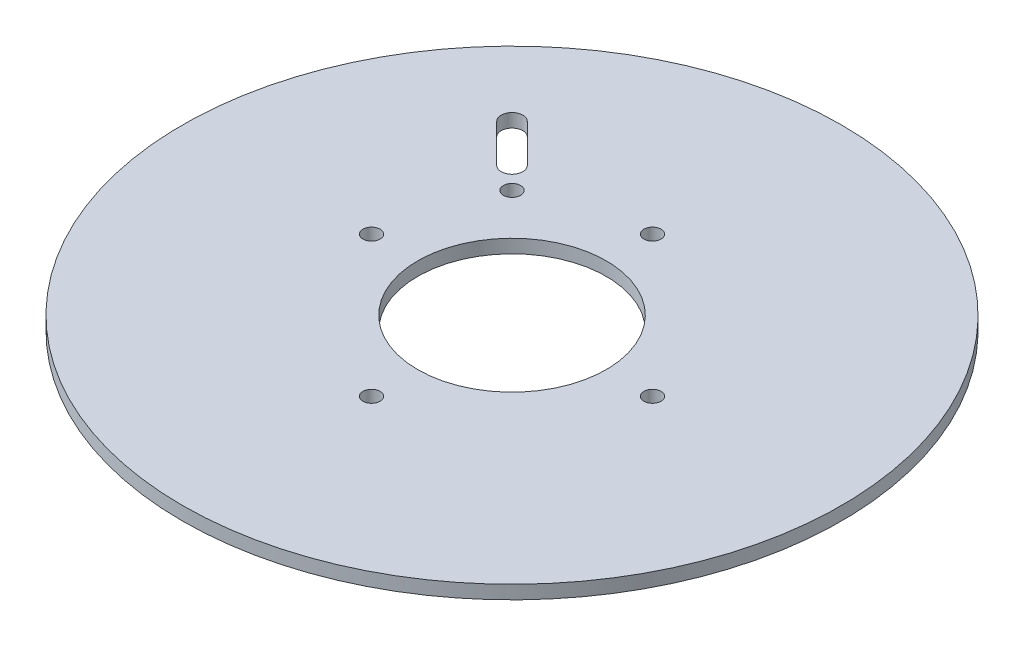
ISO-10303-21;
HEADER;
FILE_DESCRIPTION(('STEP AP214'),'2;1');
FILE_NAME('part.step','',(''),(''),'','','');
FILE_SCHEMA(('AUTOMOTIVE_DESIGN { 1 0 10303 214 1 1 1 1 }'));
ENDSEC;
DATA;
#1=APPLICATION_CONTEXT('core data for automotive mechanical design processes');
#2=APPLICATION_PROTOCOL_DEFINITION('international standard','automotive_design',2000,#1);
#3=PRODUCT_CONTEXT('',#1,'mechanical');
#4=PRODUCT('Part','Part','',(#3));
#5=PRODUCT_RELATED_PRODUCT_CATEGORY('part','',(#4));
#6=PRODUCT_DEFINITION_FORMATION('','',#4);
#7=PRODUCT_DEFINITION_CONTEXT('part definition',#1,'design');
#8=PRODUCT_DEFINITION('design','',#6,#7);
#9=PRODUCT_DEFINITION_SHAPE('','',#8);
#10=(LENGTH_UNIT() NAMED_UNIT(*) SI_UNIT(.MILLI.,.METRE.));
#11=(NAMED_UNIT(*) PLANE_ANGLE_UNIT() SI_UNIT($,.RADIAN.));
#12=(NAMED_UNIT(*) SI_UNIT($,.STERADIAN.) SOLID_ANGLE_UNIT());
#13=UNCERTAINTY_MEASURE_WITH_UNIT(LENGTH_MEASURE(1.E-05),#10,'distance_accuracy_value','');
#14=(GEOMETRIC_REPRESENTATION_CONTEXT(3) GLOBAL_UNCERTAINTY_ASSIGNED_CONTEXT((#13)) GLOBAL_UNIT_ASSIGNED_CONTEXT((#10,
#11,#12)) REPRESENTATION_CONTEXT('',''));
#15=CARTESIAN_POINT('',(0.,0.,0.));
#16=DIRECTION('',(0.,0.,1.));
#17=DIRECTION('',(1.,0.,0.));
#18=AXIS2_PLACEMENT_3D('',#15,#16,#17);
#19=CARTESIAN_POINT('',(0.,3.175,0.));
#20=DIRECTION('',(0.,-1.,0.));
#21=DIRECTION('',(0.,0.,-1.));
#22=AXIS2_PLACEMENT_3D('',#19,#20,#21);
#23=CYLINDRICAL_SURFACE('',#22,77.4600051);
#24=CARTESIAN_POINT('',(0.,3.175,0.));
#25=DIRECTION('',(0.,1.,0.));
#26=DIRECTION('',(0.,0.,1.));
#27=AXIS2_PLACEMENT_3D('',#24,#25,#26);
#28=CIRCLE('',#27,77.4600051);
#29=CARTESIAN_POINT('',(0.,3.175,77.4600051));
#30=VERTEX_POINT('',#29);
#31=EDGE_CURVE('E11',#30,#30,#28,.T.);
#32=ORIENTED_EDGE('',*,*,#31,.F.);
#33=EDGE_LOOP('',(#32));
#34=FACE_BOUND('',#33,.T.);
#35=CARTESIAN_POINT('',(0.,0.,0.));
#36=DIRECTION('',(0.,1.,0.));
#37=DIRECTION('',(0.,0.,1.));
#38=AXIS2_PLACEMENT_3D('',#35,#36,#37);
#39=CIRCLE('',#38,77.4600051);
#40=CARTESIAN_POINT('',(0.,0.,77.4600051));
#41=VERTEX_POINT('',#40);
#42=EDGE_CURVE('E37',#41,#41,#39,.T.);
#43=ORIENTED_EDGE('',*,*,#42,.T.);
#44=EDGE_LOOP('',(#43));
#45=FACE_BOUND('',#44,.T.);
#46=ADVANCED_FACE('F34',(#34,#45),#23,.T.);
#47=CARTESIAN_POINT('',(0.,3.175,0.));
#48=DIRECTION('',(0.,1.,0.));
#49=DIRECTION('',(0.,0.,1.));
#50=AXIS2_PLACEMENT_3D('',#47,#48,#49);
#51=PLANE('',#50);
#52=CARTESIAN_POINT('',(-30.48,3.175,-30.48));
#53=DIRECTION('',(0.,1.,0.));
#54=DIRECTION('',(0.,0.,1.));
#55=AXIS2_PLACEMENT_3D('',#52,#53,#54);
#56=CIRCLE('',#55,2.54000000000001);
#57=CARTESIAN_POINT('',(-32.2760512242138,3.175,-28.6839487757862));
#58=VERTEX_POINT('',#57);
#59=CARTESIAN_POINT('',(-28.6839487757862,3.175,-32.2760512242138));
#60=VERTEX_POINT('',#59);
#61=EDGE_CURVE('E48',#58,#60,#56,.T.);
#62=ORIENTED_EDGE('',*,*,#61,.F.);
#63=DIRECTION('',(0.707106781186551,0.,0.707106781186544));
#64=VECTOR('',#63,1.);
#65=CARTESIAN_POINT('',(-32.2760512242138,3.175,-28.6839487757862));
#66=LINE('',#65,#64);
#67=CARTESIAN_POINT('',(-41.256307345283,3.175,-37.6642048968553));
#68=VERTEX_POINT('',#67);
#69=EDGE_CURVE('E92',#68,#58,#66,.T.);
#70=ORIENTED_EDGE('',*,*,#69,.F.);
#71=CARTESIAN_POINT('',(-39.4602561210692,3.175,-39.4602561210691));
#72=DIRECTION('',(0.,1.,0.));
#73=DIRECTION('',(0.,0.,1.));
#74=AXIS2_PLACEMENT_3D('',#71,#72,#73);
#75=CIRCLE('',#74,2.54);
#76=CARTESIAN_POINT('',(-37.6642048968554,3.175,-41.2563073452829));
#77=VERTEX_POINT('',#76);
#78=EDGE_CURVE('E95',#77,#68,#75,.T.);
#79=ORIENTED_EDGE('',*,*,#78,.F.);
#80=DIRECTION('',(-0.707106781186552,0.,-0.707106781186543));
#81=VECTOR('',#80,1.);
#82=CARTESIAN_POINT('',(-28.6839487757862,3.175,-32.2760512242139));
#83=LINE('',#82,#81);
#84=EDGE_CURVE('E104',#60,#77,#83,.T.);
#85=ORIENTED_EDGE('',*,*,#84,.F.);
#86=EDGE_LOOP('',(#62,#70,#79,#85));
#87=FACE_BOUND('',#86,.T.);
#88=CARTESIAN_POINT('',(-33.02,3.175,0.));
#89=DIRECTION('',(0.,1.,0.));
#90=DIRECTION('',(0.,0.,1.));
#91=AXIS2_PLACEMENT_3D('',#88,#89,#90);
#92=CIRCLE('',#91,2.0193);
#93=CARTESIAN_POINT('',(-33.02,3.175,2.0193));
#94=VERTEX_POINT('',#93);
#95=EDGE_CURVE('E98',#94,#94,#92,.T.);
#96=ORIENTED_EDGE('',*,*,#95,.F.);
#97=EDGE_LOOP('',(#96));
#98=FACE_BOUND('',#97,.T.);
#99=CARTESIAN_POINT('',(0.,3.175,33.02));
#100=DIRECTION('',(0.,1.,0.));
#101=DIRECTION('',(0.,0.,1.));
#102=AXIS2_PLACEMENT_3D('',#99,#100,#101);
#103=CIRCLE('',#102,2.0193);
#104=CARTESIAN_POINT('',(0.,3.175,35.0393));
#105=VERTEX_POINT('',#104);
#106=EDGE_CURVE('E197',#105,#105,#103,.T.);
#107=ORIENTED_EDGE('',*,*,#106,.F.);
#108=EDGE_LOOP('',(#107));
#109=FACE_BOUND('',#108,.T.);
#110=CARTESIAN_POINT('',(33.02,3.175,0.));
#111=DIRECTION('',(0.,1.,0.));
#112=DIRECTION('',(0.,0.,1.));
#113=AXIS2_PLACEMENT_3D('',#110,#111,#112);
#114=CIRCLE('',#113,2.0193);
#115=CARTESIAN_POINT('',(33.02,3.175,2.0193));
#116=VERTEX_POINT('',#115);
#117=EDGE_CURVE('E129',#116,#116,#114,.T.);
#118=ORIENTED_EDGE('',*,*,#117,.F.);
#119=EDGE_LOOP('',(#118));
#120=FACE_BOUND('',#119,.T.);
#121=CARTESIAN_POINT('',(0.,3.175,-33.02));
#122=DIRECTION('',(0.,1.,0.));
#123=DIRECTION('',(0.,0.,1.));
#124=AXIS2_PLACEMENT_3D('',#121,#122,#123);
#125=CIRCLE('',#124,2.0193);
#126=CARTESIAN_POINT('',(0.,3.175,-31.0007));
#127=VERTEX_POINT('',#126);
#128=EDGE_CURVE('E123',#127,#127,#125,.T.);
#129=ORIENTED_EDGE('',*,*,#128,.F.);
#130=EDGE_LOOP('',(#129));
#131=FACE_BOUND('',#130,.T.);
#132=CARTESIAN_POINT('',(-25.4,3.175,-25.4));
#133=DIRECTION('',(0.,1.,0.));
#134=DIRECTION('',(0.,0.,1.));
#135=AXIS2_PLACEMENT_3D('',#132,#133,#134);
#136=CIRCLE('',#135,2.0193);
#137=CARTESIAN_POINT('',(-25.4,3.175,-23.3807));
#138=VERTEX_POINT('',#137);
#139=EDGE_CURVE('E117',#138,#138,#136,.T.);
#140=ORIENTED_EDGE('',*,*,#139,.F.);
#141=EDGE_LOOP('',(#140));
#142=FACE_BOUND('',#141,.T.);
#143=CARTESIAN_POINT('',(0.,3.175,0.));
#144=DIRECTION('',(0.,1.,0.));
#145=DIRECTION('',(0.,0.,1.));
#146=AXIS2_PLACEMENT_3D('',#143,#144,#145);
#147=CIRCLE('',#146,22.1615);
#148=CARTESIAN_POINT('',(0.,3.175,22.1615));
#149=VERTEX_POINT('',#148);
#150=EDGE_CURVE('E116',#149,#149,#147,.T.);
#151=ORIENTED_EDGE('',*,*,#150,.F.);
#152=EDGE_LOOP('',(#151));
#153=FACE_BOUND('',#152,.T.);
#154=ORIENTED_EDGE('',*,*,#31,.T.);
#155=EDGE_LOOP('',(#154));
#156=FACE_BOUND('',#155,.T.);
#157=ADVANCED_FACE('F141',(#87,#98,#109,#120,#131,#142,#153,#156),#51,.T.);
#158=CARTESIAN_POINT('',(0.,0.,0.));
#159=DIRECTION('',(0.,1.,0.));
#160=DIRECTION('',(0.,0.,1.));
#161=AXIS2_PLACEMENT_3D('',#158,#159,#160);
#162=PLANE('',#161);
#163=DIRECTION('',(0.707106781186551,0.,0.707106781186544));
#164=VECTOR('',#163,1.);
#165=CARTESIAN_POINT('',(-32.2760512242138,0.,-28.6839487757862));
#166=LINE('',#165,#164);
#167=CARTESIAN_POINT('',(-41.256307345283,0.,-37.6642048968553));
#168=VERTEX_POINT('',#167);
#169=CARTESIAN_POINT('',(-32.2760512242138,0.,-28.6839487757862));
#170=VERTEX_POINT('',#169);
#171=EDGE_CURVE('E82',#168,#170,#166,.T.);
#172=ORIENTED_EDGE('',*,*,#171,.T.);
#173=CARTESIAN_POINT('',(-30.48,0.,-30.48));
#174=DIRECTION('',(0.,1.,0.));
#175=DIRECTION('',(0.,0.,1.));
#176=AXIS2_PLACEMENT_3D('',#173,#174,#175);
#177=CIRCLE('',#176,2.54000000000001);
#178=CARTESIAN_POINT('',(-28.6839487757862,0.,-32.2760512242139));
#179=VERTEX_POINT('',#178);
#180=EDGE_CURVE('E76',#170,#179,#177,.T.);
#181=ORIENTED_EDGE('',*,*,#180,.T.);
#182=DIRECTION('',(-0.707106781186552,0.,-0.707106781186543));
#183=VECTOR('',#182,1.);
#184=CARTESIAN_POINT('',(-28.6839487757862,0.,-32.2760512242139));
#185=LINE('',#184,#183);
#186=CARTESIAN_POINT('',(-37.6642048968554,0.,-41.2563073452829));
#187=VERTEX_POINT('',#186);
#188=EDGE_CURVE('E85',#179,#187,#185,.T.);
#189=ORIENTED_EDGE('',*,*,#188,.T.);
#190=CARTESIAN_POINT('',(-39.4602561210692,0.,-39.4602561210691));
#191=DIRECTION('',(0.,1.,0.));
#192=DIRECTION('',(0.,0.,1.));
#193=AXIS2_PLACEMENT_3D('',#190,#191,#192);
#194=CIRCLE('',#193,2.54);
#195=EDGE_CURVE('E56',#187,#168,#194,.T.);
#196=ORIENTED_EDGE('',*,*,#195,.T.);
#197=EDGE_LOOP('',(#172,#181,#189,#196));
#198=FACE_BOUND('',#197,.T.);
#199=CARTESIAN_POINT('',(-33.02,0.,0.));
#200=DIRECTION('',(0.,1.,0.));
#201=DIRECTION('',(0.,0.,1.));
#202=AXIS2_PLACEMENT_3D('',#199,#200,#201);
#203=CIRCLE('',#202,2.0193);
#204=CARTESIAN_POINT('',(-33.02,0.,2.0193));
#205=VERTEX_POINT('',#204);
#206=EDGE_CURVE('E199',#205,#205,#203,.T.);
#207=ORIENTED_EDGE('',*,*,#206,.T.);
#208=EDGE_LOOP('',(#207));
#209=FACE_BOUND('',#208,.T.);
#210=CARTESIAN_POINT('',(0.,0.,33.02));
#211=DIRECTION('',(0.,1.,0.));
#212=DIRECTION('',(0.,0.,1.));
#213=AXIS2_PLACEMENT_3D('',#210,#211,#212);
#214=CIRCLE('',#213,2.0193);
#215=CARTESIAN_POINT('',(0.,0.,35.0393));
#216=VERTEX_POINT('',#215);
#217=EDGE_CURVE('E132',#216,#216,#214,.T.);
#218=ORIENTED_EDGE('',*,*,#217,.T.);
#219=EDGE_LOOP('',(#218));
#220=FACE_BOUND('',#219,.T.);
#221=CARTESIAN_POINT('',(33.02,0.,0.));
#222=DIRECTION('',(0.,1.,0.));
#223=DIRECTION('',(0.,0.,1.));
#224=AXIS2_PLACEMENT_3D('',#221,#222,#223);
#225=CIRCLE('',#224,2.0193);
#226=CARTESIAN_POINT('',(33.02,0.,2.0193));
#227=VERTEX_POINT('',#226);
#228=EDGE_CURVE('E126',#227,#227,#225,.T.);
#229=ORIENTED_EDGE('',*,*,#228,.T.);
#230=EDGE_LOOP('',(#229));
#231=FACE_BOUND('',#230,.T.);
#232=CARTESIAN_POINT('',(0.,0.,-33.02));
#233=DIRECTION('',(0.,1.,0.));
#234=DIRECTION('',(0.,0.,1.));
#235=AXIS2_PLACEMENT_3D('',#232,#233,#234);
#236=CIRCLE('',#235,2.0193);
#237=CARTESIAN_POINT('',(0.,0.,-31.0007));
#238=VERTEX_POINT('',#237);
#239=EDGE_CURVE('E120',#238,#238,#236,.T.);
#240=ORIENTED_EDGE('',*,*,#239,.T.);
#241=EDGE_LOOP('',(#240));
#242=FACE_BOUND('',#241,.T.);
#243=CARTESIAN_POINT('',(-25.4,0.,-25.4));
#244=DIRECTION('',(0.,1.,0.));
#245=DIRECTION('',(0.,0.,1.));
#246=AXIS2_PLACEMENT_3D('',#243,#244,#245);
#247=CIRCLE('',#246,2.0193);
#248=CARTESIAN_POINT('',(-25.4,0.,-23.3807));
#249=VERTEX_POINT('',#248);
#250=EDGE_CURVE('E113',#249,#249,#247,.T.);
#251=ORIENTED_EDGE('',*,*,#250,.T.);
#252=EDGE_LOOP('',(#251));
#253=FACE_BOUND('',#252,.T.);
#254=CARTESIAN_POINT('',(0.,0.,0.));
#255=DIRECTION('',(0.,1.,0.));
#256=DIRECTION('',(0.,0.,1.));
#257=AXIS2_PLACEMENT_3D('',#254,#255,#256);
#258=CIRCLE('',#257,22.1615);
#259=CARTESIAN_POINT('',(0.,0.,22.1615));
#260=VERTEX_POINT('',#259);
#261=EDGE_CURVE('E133',#260,#260,#258,.T.);
#262=ORIENTED_EDGE('',*,*,#261,.T.);
#263=EDGE_LOOP('',(#262));
#264=FACE_BOUND('',#263,.T.);
#265=ORIENTED_EDGE('',*,*,#42,.F.);
#266=EDGE_LOOP('',(#265));
#267=FACE_BOUND('',#266,.T.);
#268=ADVANCED_FACE('F89',(#198,#209,#220,#231,#242,#253,#264,#267),#162,.F.);
#269=CARTESIAN_POINT('',(0.,0.,0.));
#270=DIRECTION('',(0.,1.,0.));
#271=DIRECTION('',(0.,0.,1.));
#272=AXIS2_PLACEMENT_3D('',#269,#270,#271);
#273=CYLINDRICAL_SURFACE('',#272,22.1615);
#274=ORIENTED_EDGE('',*,*,#261,.F.);
#275=EDGE_LOOP('',(#274));
#276=FACE_BOUND('',#275,.T.);
#277=ORIENTED_EDGE('',*,*,#150,.T.);
#278=EDGE_LOOP('',(#277));
#279=FACE_BOUND('',#278,.T.);
#280=ADVANCED_FACE('F139',(#276,#279),#273,.F.);
#281=CARTESIAN_POINT('',(-25.4,0.,-25.4));
#282=DIRECTION('',(0.,1.,0.));
#283=DIRECTION('',(0.,0.,1.));
#284=AXIS2_PLACEMENT_3D('',#281,#282,#283);
#285=CYLINDRICAL_SURFACE('',#284,2.0193);
#286=ORIENTED_EDGE('',*,*,#250,.F.);
#287=EDGE_LOOP('',(#286));
#288=FACE_BOUND('',#287,.T.);
#289=ORIENTED_EDGE('',*,*,#139,.T.);
#290=EDGE_LOOP('',(#289));
#291=FACE_BOUND('',#290,.T.);
#292=ADVANCED_FACE('F157',(#288,#291),#285,.F.);
#293=CARTESIAN_POINT('',(0.,0.,-33.02));
#294=DIRECTION('',(0.,1.,0.));
#295=DIRECTION('',(0.,0.,1.));
#296=AXIS2_PLACEMENT_3D('',#293,#294,#295);
#297=CYLINDRICAL_SURFACE('',#296,2.0193);
#298=ORIENTED_EDGE('',*,*,#239,.F.);
#299=EDGE_LOOP('',(#298));
#300=FACE_BOUND('',#299,.T.);
#301=ORIENTED_EDGE('',*,*,#128,.T.);
#302=EDGE_LOOP('',(#301));
#303=FACE_BOUND('',#302,.T.);
#304=ADVANCED_FACE('F165',(#300,#303),#297,.F.);
#305=CARTESIAN_POINT('',(33.02,0.,0.));
#306=DIRECTION('',(0.,1.,0.));
#307=DIRECTION('',(0.,0.,1.));
#308=AXIS2_PLACEMENT_3D('',#305,#306,#307);
#309=CYLINDRICAL_SURFACE('',#308,2.0193);
#310=ORIENTED_EDGE('',*,*,#228,.F.);
#311=EDGE_LOOP('',(#310));
#312=FACE_BOUND('',#311,.T.);
#313=ORIENTED_EDGE('',*,*,#117,.T.);
#314=EDGE_LOOP('',(#313));
#315=FACE_BOUND('',#314,.T.);
#316=ADVANCED_FACE('F161',(#312,#315),#309,.F.);
#317=CARTESIAN_POINT('',(0.,0.,33.02));
#318=DIRECTION('',(0.,1.,0.));
#319=DIRECTION('',(0.,0.,1.));
#320=AXIS2_PLACEMENT_3D('',#317,#318,#319);
#321=CYLINDRICAL_SURFACE('',#320,2.0193);
#322=ORIENTED_EDGE('',*,*,#217,.F.);
#323=EDGE_LOOP('',(#322));
#324=FACE_BOUND('',#323,.T.);
#325=ORIENTED_EDGE('',*,*,#106,.T.);
#326=EDGE_LOOP('',(#325));
#327=FACE_BOUND('',#326,.T.);
#328=ADVANCED_FACE('F164',(#324,#327),#321,.F.);
#329=CARTESIAN_POINT('',(-33.02,0.,0.));
#330=DIRECTION('',(0.,1.,0.));
#331=DIRECTION('',(0.,0.,1.));
#332=AXIS2_PLACEMENT_3D('',#329,#330,#331);
#333=CYLINDRICAL_SURFACE('',#332,2.0193);
#334=ORIENTED_EDGE('',*,*,#206,.F.);
#335=EDGE_LOOP('',(#334));
#336=FACE_BOUND('',#335,.T.);
#337=ORIENTED_EDGE('',*,*,#95,.T.);
#338=EDGE_LOOP('',(#337));
#339=FACE_BOUND('',#338,.T.);
#340=ADVANCED_FACE('F176',(#336,#339),#333,.F.);
#341=CARTESIAN_POINT('',(-30.48,0.,-30.48));
#342=DIRECTION('',(0.,1.,0.));
#343=DIRECTION('',(0.,0.,1.));
#344=AXIS2_PLACEMENT_3D('',#341,#342,#343);
#345=CYLINDRICAL_SURFACE('',#344,2.54000000000001);
#346=ORIENTED_EDGE('',*,*,#61,.T.);
#347=DIRECTION('',(0.,1.,0.));
#348=VECTOR('',#347,1.);
#349=CARTESIAN_POINT('',(-28.6839487757862,0.,-32.2760512242139));
#350=LINE('',#349,#348);
#351=EDGE_CURVE('E72',#179,#60,#350,.T.);
#352=ORIENTED_EDGE('',*,*,#351,.F.);
#353=ORIENTED_EDGE('',*,*,#180,.F.);
#354=DIRECTION('',(0.,1.,0.));
#355=VECTOR('',#354,1.);
#356=CARTESIAN_POINT('',(-32.2760512242138,0.,-28.6839487757862));
#357=LINE('',#356,#355);
#358=EDGE_CURVE('E108',#170,#58,#357,.T.);
#359=ORIENTED_EDGE('',*,*,#358,.T.);
#360=EDGE_LOOP('',(#346,#352,#353,#359));
#361=FACE_BOUND('',#360,.T.);
#362=ADVANCED_FACE('F74',(#361),#345,.F.);
#363=CARTESIAN_POINT('',(-32.2760512242138,0.,-28.6839487757862));
#364=DIRECTION('',(-0.707106781186544,0.,0.707106781186551));
#365=DIRECTION('',(0.707106781186551,0.,0.707106781186544));
#366=AXIS2_PLACEMENT_3D('',#363,#364,#365);
#367=PLANE('',#366);
#368=ORIENTED_EDGE('',*,*,#69,.T.);
#369=ORIENTED_EDGE('',*,*,#358,.F.);
#370=ORIENTED_EDGE('',*,*,#171,.F.);
#371=DIRECTION('',(0.,1.,0.));
#372=VECTOR('',#371,1.);
#373=CARTESIAN_POINT('',(-41.256307345283,0.,-37.6642048968553));
#374=LINE('',#373,#372);
#375=EDGE_CURVE('E110',#168,#68,#374,.T.);
#376=ORIENTED_EDGE('',*,*,#375,.T.);
#377=EDGE_LOOP('',(#368,#369,#370,#376));
#378=FACE_BOUND('',#377,.T.);
#379=ADVANCED_FACE('F175',(#378),#367,.F.);
#380=CARTESIAN_POINT('',(-39.4602561210692,0.,-39.4602561210691));
#381=DIRECTION('',(0.,1.,0.));
#382=DIRECTION('',(0.,0.,1.));
#383=AXIS2_PLACEMENT_3D('',#380,#381,#382);
#384=CYLINDRICAL_SURFACE('',#383,2.54);
#385=ORIENTED_EDGE('',*,*,#78,.T.);
#386=ORIENTED_EDGE('',*,*,#375,.F.);
#387=ORIENTED_EDGE('',*,*,#195,.F.);
#388=DIRECTION('',(0.,1.,0.));
#389=VECTOR('',#388,1.);
#390=CARTESIAN_POINT('',(-37.6642048968554,0.,-41.2563073452829));
#391=LINE('',#390,#389);
#392=EDGE_CURVE('E81',#187,#77,#391,.T.);
#393=ORIENTED_EDGE('',*,*,#392,.T.);
#394=EDGE_LOOP('',(#385,#386,#387,#393));
#395=FACE_BOUND('',#394,.T.);
#396=ADVANCED_FACE('F179',(#395),#384,.F.);
#397=CARTESIAN_POINT('',(-28.6839487757862,0.,-32.2760512242139));
#398=DIRECTION('',(0.707106781186543,0.,-0.707106781186552));
#399=DIRECTION('',(-0.707106781186552,0.,-0.707106781186543));
#400=AXIS2_PLACEMENT_3D('',#397,#398,#399);
#401=PLANE('',#400);
#402=ORIENTED_EDGE('',*,*,#84,.T.);
#403=ORIENTED_EDGE('',*,*,#392,.F.);
#404=ORIENTED_EDGE('',*,*,#188,.F.);
#405=ORIENTED_EDGE('',*,*,#351,.T.);
#406=EDGE_LOOP('',(#402,#403,#404,#405));
#407=FACE_BOUND('',#406,.T.);
#408=ADVANCED_FACE('F86',(#407),#401,.F.);
#409=CLOSED_SHELL('',(#46,#157,#268,#280,#292,#304,#316,#328,#340,#362,#379,#396,#408));
#410=MANIFOLD_SOLID_BREP('B2',#409);
#411=ADVANCED_BREP_SHAPE_REPRESENTATION('',(#18,#410),#14);
#412=SHAPE_DEFINITION_REPRESENTATION(#9,#411);
ENDSEC;
END-ISO-10303-21;
